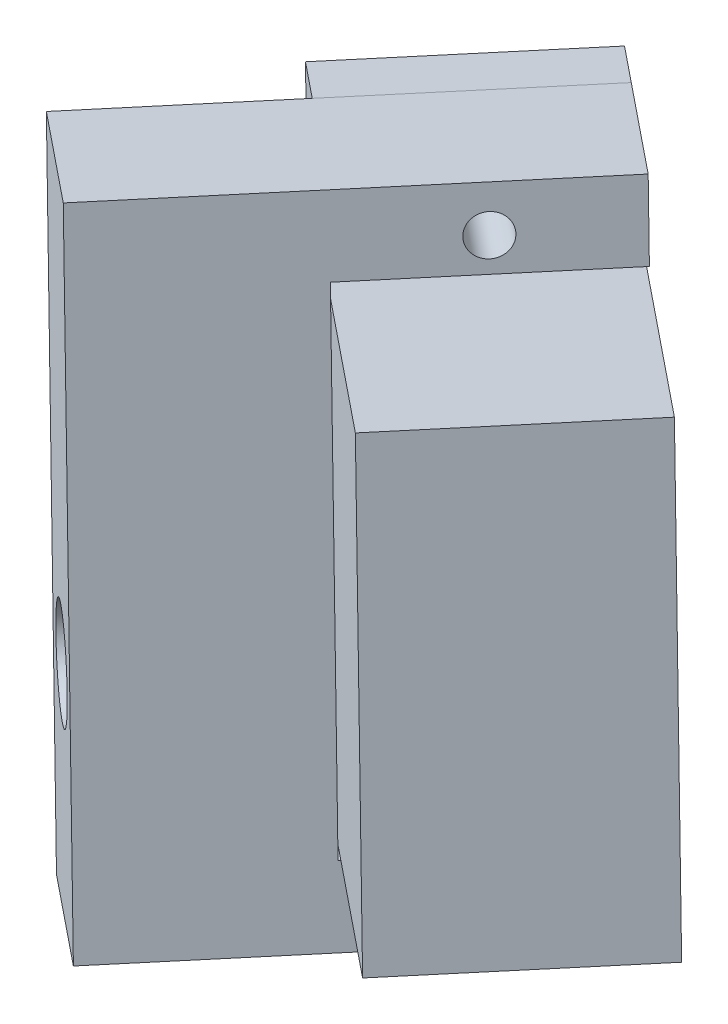
ISO-10303-21;
HEADER;
FILE_DESCRIPTION(('STEP AP214'),'2;1');
FILE_NAME('part.step','',(''),(''),'','','');
FILE_SCHEMA(('AUTOMOTIVE_DESIGN { 1 0 10303 214 1 1 1 1 }'));
ENDSEC;
DATA;
#1=APPLICATION_CONTEXT('core data for automotive mechanical design processes');
#2=APPLICATION_PROTOCOL_DEFINITION('international standard','automotive_design',2000,#1);
#3=PRODUCT_CONTEXT('',#1,'mechanical');
#4=PRODUCT('Part','Part','',(#3));
#5=PRODUCT_RELATED_PRODUCT_CATEGORY('part','',(#4));
#6=PRODUCT_DEFINITION_FORMATION('','',#4);
#7=PRODUCT_DEFINITION_CONTEXT('part definition',#1,'design');
#8=PRODUCT_DEFINITION('design','',#6,#7);
#9=PRODUCT_DEFINITION_SHAPE('','',#8);
#10=(LENGTH_UNIT() NAMED_UNIT(*) SI_UNIT(.MILLI.,.METRE.));
#11=(NAMED_UNIT(*) PLANE_ANGLE_UNIT() SI_UNIT($,.RADIAN.));
#12=(NAMED_UNIT(*) SI_UNIT($,.STERADIAN.) SOLID_ANGLE_UNIT());
#13=UNCERTAINTY_MEASURE_WITH_UNIT(LENGTH_MEASURE(1.E-05),#10,'distance_accuracy_value','');
#14=(GEOMETRIC_REPRESENTATION_CONTEXT(3) GLOBAL_UNCERTAINTY_ASSIGNED_CONTEXT((#13)) GLOBAL_UNIT_ASSIGNED_CONTEXT((#10,
#11,#12)) REPRESENTATION_CONTEXT('',''));
#15=CARTESIAN_POINT('',(0.,0.,0.));
#16=DIRECTION('',(0.,0.,1.));
#17=DIRECTION('',(1.,0.,0.));
#18=AXIS2_PLACEMENT_3D('',#15,#16,#17);
#19=CARTESIAN_POINT('',(-146.288038578442,36.1767455249788,-144.142058865633));
#20=DIRECTION('',(0.75749507175027,0.138140590001996,0.638058299583944));
#21=DIRECTION('',(-0.644234817231312,0.,0.764827758561977));
#22=AXIS2_PLACEMENT_3D('',#19,#20,#21);
#23=CYLINDRICAL_SURFACE('',#22,5.75);
#24=CARTESIAN_POINT('',(-146.288038578442,36.1767455249788,-144.142058865633));
#25=DIRECTION('',(-0.75749507175027,-0.138140590001996,-0.638058299583944));
#26=DIRECTION('',(0.644234817231312,0.,-0.764827758561977));
#27=AXIS2_PLACEMENT_3D('',#24,#25,#26);
#28=CIRCLE('',#27,5.75);
#29=CARTESIAN_POINT('',(-142.583688379362,36.1767455249787,-148.539818477364));
#30=VERTEX_POINT('',#29);
#31=EDGE_CURVE('P0_E141',#30,#30,#28,.T.);
#32=ORIENTED_EDGE('',*,*,#31,.F.);
#33=EDGE_LOOP('',(#32));
#34=FACE_BOUND('',#33,.T.);
#35=DIRECTION('',(0.75749507175027,0.138140590001996,0.638058299583944));
#36=VECTOR('',#35,1.);
#37=CARTESIAN_POINT('',(-145.903809061681,41.8163649980901,-140.725619216385));
#38=LINE('',#37,#36);
#39=CARTESIAN_POINT('',(-147.986920508995,41.4364783755846,-142.48027954024));
#40=VERTEX_POINT('',#39);
#41=CARTESIAN_POINT('',(-143.820697614368,42.1962516205956,-138.970958892529));
#42=VERTEX_POINT('',#41);
#43=EDGE_CURVE('P0_E20',#40,#42,#38,.T.);
#44=ORIENTED_EDGE('',*,*,#43,.F.);
#45=CARTESIAN_POINT('',(-145.909291042567,36.2458158199798,-143.823029715841));
#46=DIRECTION('',(-0.75749507175027,-0.138140590001996,-0.638058299583944));
#47=DIRECTION('',(0.644234817231312,0.,-0.764827758561977));
#48=AXIS2_PLACEMENT_3D('',#45,#46,#47);
#49=CIRCLE('',#48,5.75);
#50=CARTESIAN_POINT('',(-144.93910505581,41.4364783755846,-146.098609067334));
#51=VERTEX_POINT('',#50);
#52=EDGE_CURVE('P0_E130',#40,#51,#49,.T.);
#53=ORIENTED_EDGE('',*,*,#52,.T.);
#54=DIRECTION('',(0.75749507175027,0.138140590001996,0.638058299583944));
#55=VECTOR('',#54,1.);
#56=CARTESIAN_POINT('',(-142.855993608497,41.8163649980901,-144.343948743478));
#57=LINE('',#56,#55);
#58=CARTESIAN_POINT('',(-140.772882161184,42.1962516205956,-142.589288419622));
#59=VERTEX_POINT('',#58);
#60=EDGE_CURVE('P0_E120',#59,#51,#57,.F.);
#61=ORIENTED_EDGE('',*,*,#60,.F.);
#62=CARTESIAN_POINT('',(-141.743068147941,37.0055890649907,-140.313709068129));
#63=DIRECTION('',(-0.75749507175027,-0.138140590001996,-0.638058299583944));
#64=DIRECTION('',(0.644234817231312,0.,-0.764827758561977));
#65=AXIS2_PLACEMENT_3D('',#62,#63,#64);
#66=CIRCLE('',#65,5.75);
#67=EDGE_CURVE('P0_E129',#59,#42,#66,.T.);
#68=ORIENTED_EDGE('',*,*,#67,.T.);
#69=EDGE_LOOP('',(#44,#53,#61,#68));
#70=FACE_BOUND('',#69,.T.);
#71=ADVANCED_FACE('P0_F16',(#34,#70),#23,.T.);
#72=CARTESIAN_POINT('',(-141.161507768858,42.4124662567791,-139.823845251952));
#73=DIRECTION('',(0.75749507175027,0.138140590001996,0.638058299583944));
#74=DIRECTION('',(-0.644234817231312,0.,0.764827758561977));
#75=AXIS2_PLACEMENT_3D('',#72,#73,#74);
#76=PLANE('',#75);
#77=DIRECTION('',(-0.644234817231312,0.,0.764827758561977));
#78=VECTOR('',#77,1.);
#79=CARTESIAN_POINT('',(-136.107494090022,31.2703241708104,-143.411618303612));
#80=LINE('',#79,#78);
#81=CARTESIAN_POINT('',(-136.107494090022,31.2703241708104,-143.411618303612));
#82=VERTEX_POINT('',#81);
#83=CARTESIAN_POINT('',(-143.838311896797,31.2703241708104,-134.233685200868));
#84=VERTEX_POINT('',#83);
#85=EDGE_CURVE('P0_E39',#82,#84,#80,.T.);
#86=ORIENTED_EDGE('',*,*,#85,.F.);
#87=DIRECTION('',(0.105653757817654,-0.990412629863887,0.0889949777521639));
#88=VECTOR('',#87,1.);
#89=CARTESIAN_POINT('',(-138.997124366334,58.3581095975877,-145.845630945134));
#90=LINE('',#89,#88);
#91=CARTESIAN_POINT('',(-135.595073364606,26.4668229159705,-142.979992661514));
#92=VERTEX_POINT('',#91);
#93=EDGE_CURVE('P0_E177',#82,#92,#90,.T.);
#94=ORIENTED_EDGE('',*,*,#93,.T.);
#95=DIRECTION('',(-0.644234817231312,0.,0.764827758561977));
#96=VECTOR('',#95,1.);
#97=CARTESIAN_POINT('',(-135.595073364606,26.4668229159705,-142.979992661514));
#98=LINE('',#97,#96);
#99=CARTESIAN_POINT('',(-143.325891171382,26.4668229159706,-133.80205955877));
#100=VERTEX_POINT('',#99);
#101=EDGE_CURVE('P0_E168',#92,#100,#98,.T.);
#102=ORIENTED_EDGE('',*,*,#101,.T.);
#103=DIRECTION('',(-0.105653757817654,0.990412629863887,-0.0889949777521639));
#104=VECTOR('',#103,1.);
#105=CARTESIAN_POINT('',(-146.72794217311,58.3581095975877,-136.66769784239));
#106=LINE('',#105,#104);
#107=EDGE_CURVE('P0_E173',#100,#84,#106,.T.);
#108=ORIENTED_EDGE('',*,*,#107,.T.);
#109=EDGE_LOOP('',(#86,#94,#102,#108));
#110=FACE_BOUND('',#109,.T.);
#111=ADVANCED_FACE('P0_F248',(#110),#76,.F.);
#112=DIRECTION('',(0.644234817231312,0.,-0.764827758561977));
#113=VECTOR('',#112,1.);
#114=CARTESIAN_POINT('',(-138.484703640919,53.5546083427478,-145.414005303036));
#115=LINE('',#114,#113);
#116=CARTESIAN_POINT('',(-146.215521447694,53.5546083427479,-136.236072200292));
#117=VERTEX_POINT('',#116);
#118=CARTESIAN_POINT('',(-138.484703640919,53.5546083427478,-145.414005303036));
#119=VERTEX_POINT('',#118);
#120=EDGE_CURVE('P0_E146',#117,#119,#115,.T.);
#121=ORIENTED_EDGE('',*,*,#120,.F.);
#122=CARTESIAN_POINT('',(-146.72794217311,58.3581095975877,-136.66769784239));
#123=VERTEX_POINT('',#122);
#124=EDGE_CURVE('P0_E171',#117,#123,#106,.T.);
#125=ORIENTED_EDGE('',*,*,#124,.T.);
#126=DIRECTION('',(0.644234817231312,0.,-0.764827758561977));
#127=VECTOR('',#126,1.);
#128=CARTESIAN_POINT('',(-138.997124366334,58.3581095975877,-145.845630945134));
#129=LINE('',#128,#127);
#130=CARTESIAN_POINT('',(-138.997124366334,58.3581095975877,-145.845630945134));
#131=VERTEX_POINT('',#130);
#132=EDGE_CURVE('P0_E175',#123,#131,#129,.T.);
#133=ORIENTED_EDGE('',*,*,#132,.T.);
#134=EDGE_CURVE('P0_E178',#131,#119,#90,.T.);
#135=ORIENTED_EDGE('',*,*,#134,.T.);
#136=EDGE_LOOP('',(#121,#125,#133,#135));
#137=FACE_BOUND('',#136,.T.);
#138=ADVANCED_FACE('P0_F263',(#137),#76,.F.);
#139=CARTESIAN_POINT('',(-133.808595435316,31.4371427833504,-141.475194660422));
#140=DIRECTION('',(-0.105653757817654,0.990412629863887,-0.0889949777521639));
#141=DIRECTION('',(0.644234817231312,0.,-0.764827758561977));
#142=AXIS2_PLACEMENT_3D('',#139,#140,#141);
#143=PLANE('',#142);
#144=DIRECTION('',(-0.644234817231312,0.,0.764827758561977));
#145=VECTOR('',#144,1.);
#146=CARTESIAN_POINT('',(-119.794936607936,33.9927436983873,-129.671116118119));
#147=LINE('',#146,#145);
#148=CARTESIAN_POINT('',(-119.794936607936,33.9927436983873,-129.671116118119));
#149=VERTEX_POINT('',#148);
#150=CARTESIAN_POINT('',(-127.525754414712,33.9927436983874,-120.493183015375));
#151=VERTEX_POINT('',#150);
#152=EDGE_CURVE('P0_E203',#149,#151,#147,.T.);
#153=ORIENTED_EDGE('',*,*,#152,.T.);
#154=DIRECTION('',(0.75749507175027,0.138140590001996,0.638058299583944));
#155=VECTOR('',#154,1.);
#156=CARTESIAN_POINT('',(-141.539413242092,31.4371427833505,-132.297261557678));
#157=LINE('',#156,#155);
#158=CARTESIAN_POINT('',(-141.539413242092,31.4371427833505,-132.297261557678));
#159=VERTEX_POINT('',#158);
#160=EDGE_CURVE('P0_E133',#159,#151,#157,.T.);
#161=ORIENTED_EDGE('',*,*,#160,.F.);
#162=DIRECTION('',(-0.644234817231312,0.,0.764827758561977));
#163=VECTOR('',#162,1.);
#164=CARTESIAN_POINT('',(-133.808595435316,31.4371427833504,-141.475194660422));
#165=LINE('',#164,#163);
#166=CARTESIAN_POINT('',(-133.808595435316,31.4371427833504,-141.475194660422));
#167=VERTEX_POINT('',#166);
#168=EDGE_CURVE('P0_E204',#167,#159,#165,.T.);
#169=ORIENTED_EDGE('',*,*,#168,.F.);
#170=DIRECTION('',(0.75749507175027,0.138140590001996,0.638058299583944));
#171=VECTOR('',#170,1.);
#172=CARTESIAN_POINT('',(-133.808595435316,31.4371427833504,-141.475194660422));
#173=LINE('',#172,#171);
#174=EDGE_CURVE('P0_E211',#167,#149,#173,.T.);
#175=ORIENTED_EDGE('',*,*,#174,.T.);
#176=EDGE_LOOP('',(#153,#161,#169,#175));
#177=FACE_BOUND('',#176,.T.);
#178=ADVANCED_FACE('P0_F18',(#177),#143,.F.);
#179=CARTESIAN_POINT('',(-143.969449671898,54.2166332702198,-134.344146045978));
#180=DIRECTION('',(0.644234817231312,0.,-0.764827758561977));
#181=DIRECTION('',(0.105653757817654,-0.990412629863887,0.0889949777521642));
#182=AXIS2_PLACEMENT_3D('',#179,#180,#181);
#183=PLANE('',#182);
#184=DIRECTION('',(-0.105653757817654,0.990412629863887,-0.0889949777521642));
#185=VECTOR('',#184,1.);
#186=CARTESIAN_POINT('',(-129.955790844518,56.7722341852568,-122.540067503675));
#187=LINE('',#186,#185);
#188=CARTESIAN_POINT('',(-129.955790844518,56.7722341852568,-122.540067503675));
#189=VERTEX_POINT('',#188);
#190=EDGE_CURVE('P0_E214',#151,#189,#187,.T.);
#191=ORIENTED_EDGE('',*,*,#190,.T.);
#192=DIRECTION('',(0.75749507175027,0.138140590001996,0.638058299583944));
#193=VECTOR('',#192,1.);
#194=CARTESIAN_POINT('',(-143.969449671898,54.2166332702198,-134.344146045978));
#195=LINE('',#194,#193);
#196=CARTESIAN_POINT('',(-143.969449671898,54.2166332702198,-134.344146045978));
#197=VERTEX_POINT('',#196);
#198=EDGE_CURVE('P0_E137',#197,#189,#195,.T.);
#199=ORIENTED_EDGE('',*,*,#198,.F.);
#200=DIRECTION('',(-0.105653757817654,0.990412629863887,-0.0889949777521639));
#201=VECTOR('',#200,1.);
#202=CARTESIAN_POINT('',(-144.455456957859,58.7725313675937,-134.753522943638));
#203=LINE('',#202,#201);
#204=CARTESIAN_POINT('',(-144.455456957859,58.7725313675937,-134.753522943638));
#205=VERTEX_POINT('',#204);
#206=EDGE_CURVE('P0_E183',#197,#205,#203,.T.);
#207=ORIENTED_EDGE('',*,*,#206,.T.);
#208=DIRECTION('',(0.75749507175027,0.138140590001996,0.638058299583944));
#209=VECTOR('',#208,1.);
#210=CARTESIAN_POINT('',(-146.72794217311,58.3581095975877,-136.66769784239));
#211=LINE('',#210,#209);
#212=EDGE_CURVE('P0_E197',#123,#205,#211,.T.);
#213=ORIENTED_EDGE('',*,*,#212,.F.);
#214=ORIENTED_EDGE('',*,*,#124,.F.);
#215=DIRECTION('',(0.75749507175027,0.138140590001996,0.638058299583944));
#216=VECTOR('',#215,1.);
#217=CARTESIAN_POINT('',(-147.35176405532,53.3473974577449,-137.193159649668));
#218=LINE('',#217,#216);
#219=CARTESIAN_POINT('',(-147.35176405532,53.3473974577449,-137.193159649668));
#220=VERTEX_POINT('',#219);
#221=EDGE_CURVE('P0_E161',#220,#117,#218,.T.);
#222=ORIENTED_EDGE('',*,*,#221,.F.);
#223=DIRECTION('',(-0.105653757817654,0.990412629863887,-0.0889949777521639));
#224=VECTOR('',#223,1.);
#225=CARTESIAN_POINT('',(-147.35176405532,53.3473974577449,-137.193159649668));
#226=LINE('',#225,#224);
#227=CARTESIAN_POINT('',(-144.974554504423,31.0631132858074,-135.190772650244));
#228=VERTEX_POINT('',#227);
#229=EDGE_CURVE('P0_E145',#228,#220,#226,.T.);
#230=ORIENTED_EDGE('',*,*,#229,.F.);
#231=DIRECTION('',(0.75749507175027,0.138140590001996,0.638058299583944));
#232=VECTOR('',#231,1.);
#233=CARTESIAN_POINT('',(-144.974554504423,31.0631132858074,-135.190772650244));
#234=LINE('',#233,#232);
#235=EDGE_CURVE('P0_E164',#228,#84,#234,.T.);
#236=ORIENTED_EDGE('',*,*,#235,.T.);
#237=ORIENTED_EDGE('',*,*,#107,.F.);
#238=DIRECTION('',(0.75749507175027,0.138140590001996,0.638058299583944));
#239=VECTOR('',#238,1.);
#240=CARTESIAN_POINT('',(-143.325891171382,26.4668229159706,-133.80205955877));
#241=LINE('',#240,#239);
#242=CARTESIAN_POINT('',(-141.053405956131,26.8812446859766,-131.887884660018));
#243=VERTEX_POINT('',#242);
#244=EDGE_CURVE('P0_E200',#100,#243,#241,.T.);
#245=ORIENTED_EDGE('',*,*,#244,.T.);
#246=EDGE_CURVE('P0_E184',#243,#159,#203,.T.);
#247=ORIENTED_EDGE('',*,*,#246,.T.);
#248=ORIENTED_EDGE('',*,*,#160,.T.);
#249=EDGE_LOOP('',(#191,#199,#207,#213,#214,#222,#230,#236,#237,#245,#247,#248));
#250=FACE_BOUND('',#249,.T.);
#251=ADVANCED_FACE('P0_F265',(#250),#183,.F.);
#252=CARTESIAN_POINT('',(-136.238631865122,54.2166332702198,-143.522079148722));
#253=DIRECTION('',(0.105653757817654,-0.990412629863887,0.0889949777521639));
#254=DIRECTION('',(-0.644234817231312,0.,0.764827758561977));
#255=AXIS2_PLACEMENT_3D('',#252,#253,#254);
#256=PLANE('',#255);
#257=DIRECTION('',(0.644234817231312,0.,-0.764827758561977));
#258=VECTOR('',#257,1.);
#259=CARTESIAN_POINT('',(-122.224973037742,56.7722341852567,-131.718000606419));
#260=LINE('',#259,#258);
#261=CARTESIAN_POINT('',(-122.224973037742,56.7722341852567,-131.718000606419));
#262=VERTEX_POINT('',#261);
#263=EDGE_CURVE('P0_E216',#189,#262,#260,.T.);
#264=ORIENTED_EDGE('',*,*,#263,.T.);
#265=DIRECTION('',(0.75749507175027,0.138140590001996,0.638058299583944));
#266=VECTOR('',#265,1.);
#267=CARTESIAN_POINT('',(-136.238631865122,54.2166332702198,-143.522079148722));
#268=LINE('',#267,#266);
#269=CARTESIAN_POINT('',(-136.238631865122,54.2166332702198,-143.522079148722));
#270=VERTEX_POINT('',#269);
#271=EDGE_CURVE('P0_E221',#270,#262,#268,.T.);
#272=ORIENTED_EDGE('',*,*,#271,.F.);
#273=DIRECTION('',(0.644234817231312,0.,-0.764827758561977));
#274=VECTOR('',#273,1.);
#275=CARTESIAN_POINT('',(-136.238631865122,54.2166332702198,-143.522079148722));
#276=LINE('',#275,#274);
#277=EDGE_CURVE('P0_E207',#197,#270,#276,.T.);
#278=ORIENTED_EDGE('',*,*,#277,.F.);
#279=ORIENTED_EDGE('',*,*,#198,.T.);
#280=EDGE_LOOP('',(#264,#272,#278,#279));
#281=FACE_BOUND('',#280,.T.);
#282=ADVANCED_FACE('P0_F228',(#281),#256,.F.);
#283=CARTESIAN_POINT('',(-136.238631865122,54.2166332702198,-143.522079148722));
#284=DIRECTION('',(-0.644234817231312,0.,0.764827758561977));
#285=DIRECTION('',(-0.105653757817654,0.990412629863887,-0.0889949777521639));
#286=AXIS2_PLACEMENT_3D('',#283,#284,#285);
#287=PLANE('',#286);
#288=DIRECTION('',(0.105653757817654,-0.990412629863887,0.0889949777521639));
#289=VECTOR('',#288,1.);
#290=CARTESIAN_POINT('',(-122.224973037742,56.7722341852567,-131.718000606419));
#291=LINE('',#290,#289);
#292=EDGE_CURVE('P0_E208',#262,#149,#291,.T.);
#293=ORIENTED_EDGE('',*,*,#292,.T.);
#294=ORIENTED_EDGE('',*,*,#174,.F.);
#295=DIRECTION('',(0.105653757817654,-0.990412629863887,0.0889949777521639));
#296=VECTOR('',#295,1.);
#297=CARTESIAN_POINT('',(-136.724639151084,58.7725313675937,-143.931456046382));
#298=LINE('',#297,#296);
#299=CARTESIAN_POINT('',(-133.322588149355,26.8812446859765,-141.065817762762));
#300=VERTEX_POINT('',#299);
#301=EDGE_CURVE('P0_E189',#167,#300,#298,.T.);
#302=ORIENTED_EDGE('',*,*,#301,.T.);
#303=DIRECTION('',(0.75749507175027,0.138140590001996,0.638058299583944));
#304=VECTOR('',#303,1.);
#305=CARTESIAN_POINT('',(-135.595073364606,26.4668229159705,-142.979992661514));
#306=LINE('',#305,#304);
#307=EDGE_CURVE('P0_E180',#92,#300,#306,.T.);
#308=ORIENTED_EDGE('',*,*,#307,.F.);
#309=ORIENTED_EDGE('',*,*,#93,.F.);
#310=DIRECTION('',(0.75749507175027,0.138140590001996,0.638058299583944));
#311=VECTOR('',#310,1.);
#312=CARTESIAN_POINT('',(-137.243736697647,31.0631132858074,-144.368705752988));
#313=LINE('',#312,#311);
#314=CARTESIAN_POINT('',(-137.243736697647,31.0631132858074,-144.368705752988));
#315=VERTEX_POINT('',#314);
#316=EDGE_CURVE('P0_E152',#315,#82,#313,.T.);
#317=ORIENTED_EDGE('',*,*,#316,.F.);
#318=DIRECTION('',(0.105653757817654,-0.990412629863887,0.0889949777521639));
#319=VECTOR('',#318,1.);
#320=CARTESIAN_POINT('',(-139.620946248544,53.3473974577449,-146.371092752411));
#321=LINE('',#320,#319);
#322=CARTESIAN_POINT('',(-139.620946248544,53.3473974577449,-146.371092752411));
#323=VERTEX_POINT('',#322);
#324=EDGE_CURVE('P0_E150',#323,#315,#321,.T.);
#325=ORIENTED_EDGE('',*,*,#324,.F.);
#326=DIRECTION('',(0.75749507175027,0.138140590001996,0.638058299583944));
#327=VECTOR('',#326,1.);
#328=CARTESIAN_POINT('',(-139.620946248544,53.3473974577449,-146.371092752411));
#329=LINE('',#328,#327);
#330=EDGE_CURVE('P0_E158',#323,#119,#329,.T.);
#331=ORIENTED_EDGE('',*,*,#330,.T.);
#332=ORIENTED_EDGE('',*,*,#134,.F.);
#333=DIRECTION('',(0.75749507175027,0.138140590001996,0.638058299583944));
#334=VECTOR('',#333,1.);
#335=CARTESIAN_POINT('',(-138.997124366334,58.3581095975877,-145.845630945134));
#336=LINE('',#335,#334);
#337=CARTESIAN_POINT('',(-136.724639151084,58.7725313675937,-143.931456046382));
#338=VERTEX_POINT('',#337);
#339=EDGE_CURVE('P0_E194',#131,#338,#336,.T.);
#340=ORIENTED_EDGE('',*,*,#339,.T.);
#341=EDGE_CURVE('P0_E172',#338,#270,#298,.T.);
#342=ORIENTED_EDGE('',*,*,#341,.T.);
#343=ORIENTED_EDGE('',*,*,#271,.T.);
#344=EDGE_LOOP('',(#293,#294,#302,#308,#309,#317,#325,#331,#332,#340,#342,#343));
#345=FACE_BOUND('',#344,.T.);
#346=ADVANCED_FACE('P0_F236',(#345),#287,.F.);
#347=CARTESIAN_POINT('',(-124.875363726227,45.3824889418221,-126.105591810897));
#348=DIRECTION('',(0.75749507175027,0.138140590001996,0.638058299583944));
#349=DIRECTION('',(-0.644234817231312,0.,0.764827758561977));
#350=AXIS2_PLACEMENT_3D('',#347,#348,#349);
#351=PLANE('',#350);
#352=ORIENTED_EDGE('',*,*,#152,.F.);
#353=ORIENTED_EDGE('',*,*,#292,.F.);
#354=ORIENTED_EDGE('',*,*,#263,.F.);
#355=ORIENTED_EDGE('',*,*,#190,.F.);
#356=EDGE_LOOP('',(#352,#353,#354,#355));
#357=FACE_BOUND('',#356,.T.);
#358=ADVANCED_FACE('P0_F234',(#357),#351,.T.);
#359=CARTESIAN_POINT('',(-138.889022553607,42.8268880267851,-137.9096703532));
#360=DIRECTION('',(0.75749507175027,0.138140590001996,0.638058299583944));
#361=DIRECTION('',(-0.644234817231312,0.,0.764827758561977));
#362=AXIS2_PLACEMENT_3D('',#359,#360,#361);
#363=PLANE('',#362);
#364=ORIENTED_EDGE('',*,*,#301,.F.);
#365=ORIENTED_EDGE('',*,*,#168,.T.);
#366=ORIENTED_EDGE('',*,*,#246,.F.);
#367=DIRECTION('',(-0.644234817231312,0.,0.764827758561977));
#368=VECTOR('',#367,1.);
#369=CARTESIAN_POINT('',(-133.322588149355,26.8812446859765,-141.065817762762));
#370=LINE('',#369,#368);
#371=EDGE_CURVE('P0_E167',#300,#243,#370,.T.);
#372=ORIENTED_EDGE('',*,*,#371,.F.);
#373=EDGE_LOOP('',(#364,#365,#366,#372));
#374=FACE_BOUND('',#373,.T.);
#375=ADVANCED_FACE('P0_F242',(#374),#363,.T.);
#376=CARTESIAN_POINT('',(-135.595073364606,26.4668229159705,-142.979992661514));
#377=DIRECTION('',(-0.105653757817654,0.990412629863887,-0.0889949777521639));
#378=DIRECTION('',(0.644234817231312,0.,-0.764827758561977));
#379=AXIS2_PLACEMENT_3D('',#376,#377,#378);
#380=PLANE('',#379);
#381=ORIENTED_EDGE('',*,*,#371,.T.);
#382=ORIENTED_EDGE('',*,*,#244,.F.);
#383=ORIENTED_EDGE('',*,*,#101,.F.);
#384=ORIENTED_EDGE('',*,*,#307,.T.);
#385=EDGE_LOOP('',(#381,#382,#383,#384));
#386=FACE_BOUND('',#385,.T.);
#387=ADVANCED_FACE('P0_F246',(#386),#380,.F.);
#388=CARTESIAN_POINT('',(-138.997124366334,58.3581095975877,-145.845630945134));
#389=DIRECTION('',(0.105653757817654,-0.990412629863887,0.0889949777521639));
#390=DIRECTION('',(-0.644234817231312,0.,0.764827758561977));
#391=AXIS2_PLACEMENT_3D('',#388,#389,#390);
#392=PLANE('',#391);
#393=DIRECTION('',(0.644234817231312,0.,-0.764827758561977));
#394=VECTOR('',#393,1.);
#395=CARTESIAN_POINT('',(-136.724639151084,58.7725313675937,-143.931456046382));
#396=LINE('',#395,#394);
#397=EDGE_CURVE('P0_E187',#205,#338,#396,.T.);
#398=ORIENTED_EDGE('',*,*,#397,.T.);
#399=ORIENTED_EDGE('',*,*,#339,.F.);
#400=ORIENTED_EDGE('',*,*,#132,.F.);
#401=ORIENTED_EDGE('',*,*,#212,.T.);
#402=EDGE_LOOP('',(#398,#399,#400,#401));
#403=FACE_BOUND('',#402,.T.);
#404=ADVANCED_FACE('P0_F270',(#403),#392,.F.);
#405=ORIENTED_EDGE('',*,*,#206,.F.);
#406=ORIENTED_EDGE('',*,*,#277,.T.);
#407=ORIENTED_EDGE('',*,*,#341,.F.);
#408=ORIENTED_EDGE('',*,*,#397,.F.);
#409=EDGE_LOOP('',(#405,#406,#407,#408));
#410=FACE_BOUND('',#409,.T.);
#411=ADVANCED_FACE('P0_F273',(#410),#363,.T.);
#412=CARTESIAN_POINT('',(-137.243736697647,31.0631132858074,-144.368705752988));
#413=DIRECTION('',(-0.105653757817654,0.990412629863887,-0.0889949777521639));
#414=DIRECTION('',(0.644234817231312,0.,-0.764827758561977));
#415=AXIS2_PLACEMENT_3D('',#412,#413,#414);
#416=PLANE('',#415);
#417=ORIENTED_EDGE('',*,*,#85,.T.);
#418=ORIENTED_EDGE('',*,*,#235,.F.);
#419=DIRECTION('',(-0.644234817231312,0.,0.764827758561977));
#420=VECTOR('',#419,1.);
#421=CARTESIAN_POINT('',(-137.243736697647,31.0631132858074,-144.368705752988));
#422=LINE('',#421,#420);
#423=EDGE_CURVE('P0_E142',#315,#228,#422,.T.);
#424=ORIENTED_EDGE('',*,*,#423,.F.);
#425=ORIENTED_EDGE('',*,*,#316,.T.);
#426=EDGE_LOOP('',(#417,#418,#424,#425));
#427=FACE_BOUND('',#426,.T.);
#428=ADVANCED_FACE('P0_F253',(#427),#416,.F.);
#429=CARTESIAN_POINT('',(-139.620946248544,53.3473974577449,-146.371092752411));
#430=DIRECTION('',(0.105653757817654,-0.990412629863887,0.0889949777521639));
#431=DIRECTION('',(-0.644234817231312,0.,0.764827758561977));
#432=AXIS2_PLACEMENT_3D('',#429,#430,#431);
#433=PLANE('',#432);
#434=ORIENTED_EDGE('',*,*,#120,.T.);
#435=ORIENTED_EDGE('',*,*,#330,.F.);
#436=DIRECTION('',(0.644234817231312,0.,-0.764827758561977));
#437=VECTOR('',#436,1.);
#438=CARTESIAN_POINT('',(-139.620946248544,53.3473974577449,-146.371092752411));
#439=LINE('',#438,#437);
#440=EDGE_CURVE('P0_E148',#220,#323,#439,.T.);
#441=ORIENTED_EDGE('',*,*,#440,.F.);
#442=ORIENTED_EDGE('',*,*,#221,.T.);
#443=EDGE_LOOP('',(#434,#435,#441,#442));
#444=FACE_BOUND('',#443,.T.);
#445=ADVANCED_FACE('P0_F260',(#444),#433,.F.);
#446=CARTESIAN_POINT('',(-142.297750376483,42.2052553717761,-140.780932701328));
#447=DIRECTION('',(0.75749507175027,0.138140590001996,0.638058299583944));
#448=DIRECTION('',(-0.644234817231312,0.,0.764827758561977));
#449=AXIS2_PLACEMENT_3D('',#446,#447,#448);
#450=PLANE('',#449);
#451=CARTESIAN_POINT('',(-142.382273382738,42.9975854756673,-140.852128683529));
#452=DIRECTION('',(-0.75749507175027,-0.138140590001996,-0.638058299583944));
#453=DIRECTION('',(0.644234817231312,0.,-0.764827758561977));
#454=AXIS2_PLACEMENT_3D('',#451,#452,#453);
#455=CIRCLE('',#454,2.5);
#456=EDGE_CURVE('P0_E117',#42,#59,#455,.T.);
#457=ORIENTED_EDGE('',*,*,#456,.F.);
#458=ORIENTED_EDGE('',*,*,#67,.F.);
#459=EDGE_LOOP('',(#457,#458));
#460=FACE_BOUND('',#459,.T.);
#461=ORIENTED_EDGE('',*,*,#423,.T.);
#462=ORIENTED_EDGE('',*,*,#229,.T.);
#463=ORIENTED_EDGE('',*,*,#440,.T.);
#464=ORIENTED_EDGE('',*,*,#324,.T.);
#465=EDGE_LOOP('',(#461,#462,#463,#464));
#466=FACE_BOUND('',#465,.T.);
#467=ADVANCED_FACE('P0_F131',(#460,#466),#450,.F.);
#468=CARTESIAN_POINT('',(-146.288038578442,36.1767455249788,-144.142058865633));
#469=DIRECTION('',(-0.75749507175027,-0.138140590001996,-0.638058299583944));
#470=DIRECTION('',(0.644234817231312,0.,-0.764827758561977));
#471=AXIS2_PLACEMENT_3D('',#468,#469,#470);
#472=PLANE('',#471);
#473=CARTESIAN_POINT('',(-146.288038578442,36.1767455249788,-144.142058865633));
#474=DIRECTION('',(-0.75749507175027,-0.138140590001996,-0.638058299583944));
#475=DIRECTION('',(0.644234817231312,0.,-0.764827758561977));
#476=AXIS2_PLACEMENT_3D('',#473,#474,#475);
#477=CIRCLE('',#476,2.5);
#478=CARTESIAN_POINT('',(-144.677451535364,36.1767455249788,-146.054128262037));
#479=VERTEX_POINT('',#478);
#480=EDGE_CURVE('P0_E10',#479,#479,#477,.T.);
#481=ORIENTED_EDGE('',*,*,#480,.F.);
#482=EDGE_LOOP('',(#481));
#483=FACE_BOUND('',#482,.T.);
#484=ORIENTED_EDGE('',*,*,#31,.T.);
#485=EDGE_LOOP('',(#484));
#486=FACE_BOUND('',#485,.T.);
#487=ADVANCED_FACE('P0_F294',(#483,#486),#472,.T.);
#488=CARTESIAN_POINT('',(-146.548496277364,42.2378122306563,-144.361449331241));
#489=DIRECTION('',(0.75749507175027,0.138140590001996,0.638058299583944));
#490=DIRECTION('',(-0.644234817231312,0.,0.764827758561977));
#491=AXIS2_PLACEMENT_3D('',#488,#489,#490);
#492=CYLINDRICAL_SURFACE('',#491,2.5);
#493=CARTESIAN_POINT('',(-146.548496277364,42.2378122306563,-144.361449331241));
#494=DIRECTION('',(-0.75749507175027,-0.138140590001996,-0.638058299583944));
#495=DIRECTION('',(0.644234817231312,0.,-0.764827758561977));
#496=AXIS2_PLACEMENT_3D('',#493,#494,#495);
#497=CIRCLE('',#496,2.5);
#498=EDGE_CURVE('P0_E31',#40,#51,#497,.T.);
#499=ORIENTED_EDGE('',*,*,#498,.F.);
#500=ORIENTED_EDGE('',*,*,#43,.T.);
#501=ORIENTED_EDGE('',*,*,#456,.T.);
#502=ORIENTED_EDGE('',*,*,#60,.T.);
#503=EDGE_LOOP('',(#499,#500,#501,#502));
#504=FACE_BOUND('',#503,.T.);
#505=ADVANCED_FACE('P0_F119',(#504),#492,.T.);
#506=CARTESIAN_POINT('',(-146.548496277364,42.2378122306563,-144.361449331241));
#507=DIRECTION('',(-0.75749507175027,-0.138140590001996,-0.638058299583944));
#508=DIRECTION('',(0.644234817231312,0.,-0.764827758561977));
#509=AXIS2_PLACEMENT_3D('',#506,#507,#508);
#510=PLANE('',#509);
#511=ORIENTED_EDGE('',*,*,#52,.F.);
#512=ORIENTED_EDGE('',*,*,#498,.T.);
#513=EDGE_LOOP('',(#511,#512));
#514=FACE_BOUND('',#513,.T.);
#515=ADVANCED_FACE('P0_F322',(#514),#510,.T.);
#516=CARTESIAN_POINT('',(-148.939271329568,35.6932534599718,-146.375262914176));
#517=DIRECTION('',(0.75749507175027,0.138140590001996,0.638058299583944));
#518=DIRECTION('',(-0.644234817231312,0.,0.764827758561977));
#519=AXIS2_PLACEMENT_3D('',#516,#517,#518);
#520=CYLINDRICAL_SURFACE('',#519,2.5);
#521=CARTESIAN_POINT('',(-148.939271329568,35.6932534599718,-146.375262914176));
#522=DIRECTION('',(-0.75749507175027,-0.138140590001996,-0.638058299583944));
#523=DIRECTION('',(0.644234817231312,0.,-0.764827758561977));
#524=AXIS2_PLACEMENT_3D('',#521,#522,#523);
#525=CIRCLE('',#524,2.5);
#526=CARTESIAN_POINT('',(-147.32868428649,35.6932534599718,-148.287332310581));
#527=VERTEX_POINT('',#526);
#528=EDGE_CURVE('P0_E126',#527,#527,#525,.T.);
#529=ORIENTED_EDGE('',*,*,#528,.F.);
#530=EDGE_LOOP('',(#529));
#531=FACE_BOUND('',#530,.T.);
#532=ORIENTED_EDGE('',*,*,#480,.T.);
#533=EDGE_LOOP('',(#532));
#534=FACE_BOUND('',#533,.T.);
#535=ADVANCED_FACE('P0_F328',(#531,#534),#520,.T.);
#536=CARTESIAN_POINT('',(-148.939271329568,35.6932534599718,-146.375262914176));
#537=DIRECTION('',(-0.75749507175027,-0.138140590001996,-0.638058299583944));
#538=DIRECTION('',(0.644234817231312,0.,-0.764827758561977));
#539=AXIS2_PLACEMENT_3D('',#536,#537,#538);
#540=PLANE('',#539);
#541=ORIENTED_EDGE('',*,*,#528,.T.);
#542=EDGE_LOOP('',(#541));
#543=FACE_BOUND('',#542,.T.);
#544=ADVANCED_FACE('P0_F335',(#543),#540,.T.);
#545=CLOSED_SHELL('',(#71,#111,#138,#178,#251,#282,#346,#358,#375,#387,#404,#411,#428,#445,#467,
#487,#505,#515,#535,#544));
#546=MANIFOLD_SOLID_BREP('P0_B1',#545);
#547=CARTESIAN_POINT('',(-128.740772629615,45.3824889418222,-121.516625259525));
#548=DIRECTION('',(-0.644234817231312,0.,0.764827758561978));
#549=DIRECTION('',(-0.105653757817657,0.990412629863887,-0.08899497775216));
#550=AXIS2_PLACEMENT_3D('',#547,#548,#549);
#551=PLANE('',#550);
#552=CARTESIAN_POINT('',(-139.359142709389,38.1452489325073,-130.460761545189));
#553=DIRECTION('',(-0.644234817231312,0.,0.764827758561978));
#554=DIRECTION('',(-0.105653757817657,0.990412629863887,-0.08899497775216));
#555=AXIS2_PLACEMENT_3D('',#552,#553,#554);
#556=CIRCLE('',#555,2.5);
#557=CARTESIAN_POINT('',(-139.623277103933,40.621280507167,-130.68324898957));
#558=VERTEX_POINT('',#557);
#559=EDGE_CURVE('P1_E169',#558,#558,#556,.F.);
#560=ORIENTED_EDGE('',*,*,#559,.F.);
#561=EDGE_LOOP('',(#560));
#562=FACE_BOUND('',#561,.T.);
#563=DIRECTION('',(0.75749507175027,0.138140590001996,0.638058299583944));
#564=VECTOR('',#563,1.);
#565=CARTESIAN_POINT('',(-127.45179678424,33.2994548574828,-120.430886530949));
#566=LINE('',#565,#564);
#567=CARTESIAN_POINT('',(-141.46545561162,30.7438539424459,-132.234965073252));
#568=VERTEX_POINT('',#567);
#569=CARTESIAN_POINT('',(-135.784242573493,31.7799083674608,-127.449527826372));
#570=VERTEX_POINT('',#569);
#571=EDGE_CURVE('P1_E32',#568,#570,#566,.T.);
#572=ORIENTED_EDGE('',*,*,#571,.F.);
#573=DIRECTION('',(-0.105653757817657,0.990412629863887,-0.08899497775216));
#574=VECTOR('',#573,1.);
#575=CARTESIAN_POINT('',(-142.754431456995,42.8268880267853,-133.320703801828));
#576=LINE('',#575,#574);
#577=CARTESIAN_POINT('',(-144.043407302371,54.9099221111247,-134.406442530404));
#578=VERTEX_POINT('',#577);
#579=EDGE_CURVE('P1_E82',#568,#578,#576,.T.);
#580=ORIENTED_EDGE('',*,*,#579,.T.);
#581=DIRECTION('',(0.75749507175027,0.138140590001996,0.638058299583944));
#582=VECTOR('',#581,1.);
#583=CARTESIAN_POINT('',(-130.029748474991,57.4655230261616,-122.602363988101));
#584=LINE('',#583,#582);
#585=CARTESIAN_POINT('',(-138.362194264244,55.9459765361397,-129.621005283525));
#586=VERTEX_POINT('',#585);
#587=EDGE_CURVE('P1_E81',#578,#586,#584,.T.);
#588=ORIENTED_EDGE('',*,*,#587,.T.);
#589=DIRECTION('',(-0.105653757817657,0.990412629863887,-0.08899497775216));
#590=VECTOR('',#589,1.);
#591=CARTESIAN_POINT('',(-137.073218418868,43.8629424518002,-128.535266554948));
#592=LINE('',#591,#590);
#593=EDGE_CURVE('P1_E39',#570,#586,#592,.T.);
#594=ORIENTED_EDGE('',*,*,#593,.F.);
#595=EDGE_LOOP('',(#572,#580,#588,#594));
#596=FACE_BOUND('',#595,.T.);
#597=ADVANCED_FACE('P1_F17',(#562,#596),#551,.F.);
#598=CARTESIAN_POINT('',(-143.515566591181,43.8629424518002,-120.886988969329));
#599=DIRECTION('',(-0.75749507175027,-0.138140590001996,-0.638058299583944));
#600=DIRECTION('',(-0.644234817231312,0.,0.764827758561978));
#601=AXIS2_PLACEMENT_3D('',#598,#599,#600);
#602=PLANE('',#601);
#603=CARTESIAN_POINT('',(-134.671114061255,57.580157375415,-134.356813548188));
#604=DIRECTION('',(-0.75749507175027,-0.138140590001996,-0.638058299583944));
#605=DIRECTION('',(-0.644234817231312,0.,0.764827758561978));
#606=AXIS2_PLACEMENT_3D('',#603,#604,#605);
#607=CIRCLE('',#606,1.00000000000001);
#608=CARTESIAN_POINT('',(-135.315348878486,57.580157375415,-133.591985789626));
#609=VERTEX_POINT('',#608);
#610=EDGE_CURVE('P1_E98',#609,#609,#607,.F.);
#611=ORIENTED_EDGE('',*,*,#610,.F.);
#612=EDGE_LOOP('',(#611));
#613=FACE_BOUND('',#612,.T.);
#614=CARTESIAN_POINT('',(-131.744504969706,30.1457275281853,-131.891652664453));
#615=DIRECTION('',(-0.75749507175027,-0.138140590001996,-0.638058299583944));
#616=DIRECTION('',(-0.644234817231312,0.,0.764827758561978));
#617=AXIS2_PLACEMENT_3D('',#614,#615,#616);
#618=CIRCLE('',#617,0.98634220064662);
#619=CARTESIAN_POINT('',(-132.379940957067,30.1457275281853,-131.137270769957));
#620=VERTEX_POINT('',#619);
#621=EDGE_CURVE('P1_E167',#620,#620,#618,.F.);
#622=ORIENTED_EDGE('',*,*,#621,.F.);
#623=EDGE_LOOP('',(#622));
#624=FACE_BOUND('',#623,.T.);
#625=DIRECTION('',(0.644234817231312,0.,-0.764827758561978));
#626=VECTOR('',#625,1.);
#627=CARTESIAN_POINT('',(-141.814541090317,27.9172991109916,-119.454169827519));
#628=LINE('',#627,#626);
#629=CARTESIAN_POINT('',(-141.814541090317,27.9172991109916,-119.454169827519));
#630=VERTEX_POINT('',#629);
#631=CARTESIAN_POINT('',(-127.641375111228,27.9172991109917,-136.280380515882));
#632=VERTEX_POINT('',#631);
#633=EDGE_CURVE('P1_E135',#630,#632,#628,.T.);
#634=ORIENTED_EDGE('',*,*,#633,.T.);
#635=DIRECTION('',(0.105653757817657,-0.990412629863887,0.0889949777521598));
#636=VECTOR('',#635,1.);
#637=CARTESIAN_POINT('',(-129.342400612093,43.8629424518003,-137.713199657692));
#638=LINE('',#637,#636);
#639=CARTESIAN_POINT('',(-128.053424766717,31.7799083674608,-136.627460929116));
#640=VERTEX_POINT('',#639);
#641=EDGE_CURVE('P1_E89',#640,#632,#638,.T.);
#642=ORIENTED_EDGE('',*,*,#641,.F.);
#643=DIRECTION('',(-0.644234817231312,0.,0.764827758561977));
#644=VECTOR('',#643,1.);
#645=CARTESIAN_POINT('',(-122.607449079026,31.7799083674609,-143.092857189909));
#646=LINE('',#645,#644);
#647=EDGE_CURVE('P1_E87',#640,#570,#646,.T.);
#648=ORIENTED_EDGE('',*,*,#647,.T.);
#649=ORIENTED_EDGE('',*,*,#593,.T.);
#650=DIRECTION('',(-0.644234817231312,0.,0.764827758561977));
#651=VECTOR('',#650,1.);
#652=CARTESIAN_POINT('',(-125.185400769777,55.9459765361397,-145.264334647061));
#653=LINE('',#652,#651);
#654=CARTESIAN_POINT('',(-130.631376457468,55.9459765361397,-138.798938386268));
#655=VERTEX_POINT('',#654);
#656=EDGE_CURVE('P1_E114',#655,#586,#653,.T.);
#657=ORIENTED_EDGE('',*,*,#656,.F.);
#658=DIRECTION('',(0.105653757817657,-0.990412629863887,0.0889949777521598));
#659=VECTOR('',#658,1.);
#660=CARTESIAN_POINT('',(-129.342400612093,43.8629424518003,-137.713199657692));
#661=LINE('',#660,#659);
#662=CARTESIAN_POINT('',(-131.043426112957,59.8085857926089,-139.146018799502));
#663=VERTEX_POINT('',#662);
#664=EDGE_CURVE('P1_E111',#663,#655,#661,.T.);
#665=ORIENTED_EDGE('',*,*,#664,.F.);
#666=DIRECTION('',(0.644234817231312,0.,-0.764827758561978));
#667=VECTOR('',#666,1.);
#668=CARTESIAN_POINT('',(-145.216592092046,59.8085857926088,-122.319808111138));
#669=LINE('',#668,#667);
#670=CARTESIAN_POINT('',(-145.216592092046,59.8085857926088,-122.319808111138));
#671=VERTEX_POINT('',#670);
#672=EDGE_CURVE('P1_E11',#671,#663,#669,.T.);
#673=ORIENTED_EDGE('',*,*,#672,.F.);
#674=DIRECTION('',(-0.105653757817657,0.990412629863887,-0.08899497775216));
#675=VECTOR('',#674,1.);
#676=CARTESIAN_POINT('',(-143.515566591181,43.8629424518002,-120.886988969329));
#677=LINE('',#676,#675);
#678=EDGE_CURVE('P1_E126',#630,#671,#677,.T.);
#679=ORIENTED_EDGE('',*,*,#678,.F.);
#680=EDGE_LOOP('',(#634,#642,#648,#649,#657,#665,#673,#679));
#681=FACE_BOUND('',#680,.T.);
#682=ADVANCED_FACE('P1_F19',(#613,#624,#681),#602,.F.);
#683=CARTESIAN_POINT('',(-136.884146302793,61.3281322826308,-115.301166815715));
#684=DIRECTION('',(-0.105653757817657,0.990412629863887,-0.08899497775216));
#685=DIRECTION('',(0.644234817231312,0.,-0.764827758561978));
#686=AXIS2_PLACEMENT_3D('',#683,#684,#685);
#687=PLANE('',#686);
#688=ORIENTED_EDGE('',*,*,#672,.T.);
#689=DIRECTION('',(-0.75749507175027,-0.138140590001996,-0.638058299583944));
#690=VECTOR('',#689,1.);
#691=CARTESIAN_POINT('',(-122.710980323704,61.3281322826308,-132.127377504078));
#692=LINE('',#691,#690);
#693=CARTESIAN_POINT('',(-136.724639151084,58.7725313675939,-143.931456046381));
#694=VERTEX_POINT('',#693);
#695=EDGE_CURVE('P1_E113',#663,#694,#692,.T.);
#696=ORIENTED_EDGE('',*,*,#695,.T.);
#697=DIRECTION('',(0.644234817231312,0.,-0.764827758561978));
#698=VECTOR('',#697,1.);
#699=CARTESIAN_POINT('',(-150.897805130173,58.7725313675938,-127.105245358018));
#700=LINE('',#699,#698);
#701=CARTESIAN_POINT('',(-150.897805130173,58.7725313675938,-127.105245358018));
#702=VERTEX_POINT('',#701);
#703=EDGE_CURVE('P1_E25',#702,#694,#700,.T.);
#704=ORIENTED_EDGE('',*,*,#703,.F.);
#705=DIRECTION('',(0.75749507175027,0.138140590001996,0.638058299583944));
#706=VECTOR('',#705,1.);
#707=CARTESIAN_POINT('',(-136.884146302793,61.3281322826308,-115.301166815715));
#708=LINE('',#707,#706);
#709=EDGE_CURVE('P1_E128',#702,#671,#708,.T.);
#710=ORIENTED_EDGE('',*,*,#709,.T.);
#711=EDGE_LOOP('',(#688,#696,#704,#710));
#712=FACE_BOUND('',#711,.T.);
#713=ADVANCED_FACE('P1_F152',(#712),#687,.T.);
#714=CARTESIAN_POINT('',(-149.196779629308,42.8268880267853,-125.672426216208));
#715=DIRECTION('',(-0.75749507175027,-0.138140590001996,-0.638058299583944));
#716=DIRECTION('',(-0.644234817231312,0.,0.764827758561978));
#717=AXIS2_PLACEMENT_3D('',#714,#715,#716);
#718=PLANE('',#717);
#719=CARTESIAN_POINT('',(-140.352327099382,56.5441029504,-139.142250795067));
#720=DIRECTION('',(-0.75749507175027,-0.138140590001996,-0.638058299583944));
#721=DIRECTION('',(-0.644234817231312,0.,0.764827758561978));
#722=AXIS2_PLACEMENT_3D('',#719,#720,#721);
#723=CIRCLE('',#722,1.00000000000001);
#724=CARTESIAN_POINT('',(-140.996561916613,56.5441029504,-138.377423036505));
#725=VERTEX_POINT('',#724);
#726=EDGE_CURVE('P1_E102',#725,#725,#723,.T.);
#727=ORIENTED_EDGE('',*,*,#726,.F.);
#728=EDGE_LOOP('',(#727));
#729=FACE_BOUND('',#728,.T.);
#730=CARTESIAN_POINT('',(-137.425718007833,29.1096731031704,-136.677089911332));
#731=DIRECTION('',(-0.75749507175027,-0.138140590001996,-0.638058299583944));
#732=DIRECTION('',(-0.644234817231312,0.,0.764827758561978));
#733=AXIS2_PLACEMENT_3D('',#730,#731,#732);
#734=CIRCLE('',#733,0.98634220064662);
#735=CARTESIAN_POINT('',(-138.061153995194,29.1096731031704,-135.922708016837));
#736=VERTEX_POINT('',#735);
#737=EDGE_CURVE('P1_E164',#736,#736,#734,.T.);
#738=ORIENTED_EDGE('',*,*,#737,.F.);
#739=EDGE_LOOP('',(#738));
#740=FACE_BOUND('',#739,.T.);
#741=ORIENTED_EDGE('',*,*,#579,.F.);
#742=DIRECTION('',(-0.644234817231312,0.,0.764827758561977));
#743=VECTOR('',#742,1.);
#744=CARTESIAN_POINT('',(-128.288662117153,30.7438539424459,-147.878294436788));
#745=LINE('',#744,#743);
#746=CARTESIAN_POINT('',(-133.734637804844,30.7438539424459,-141.412898175995));
#747=VERTEX_POINT('',#746);
#748=EDGE_CURVE('P1_E93',#747,#568,#745,.T.);
#749=ORIENTED_EDGE('',*,*,#748,.F.);
#750=DIRECTION('',(0.105653757817657,-0.990412629863887,0.0889949777521598));
#751=VECTOR('',#750,1.);
#752=CARTESIAN_POINT('',(-135.02361365022,42.8268880267853,-142.498636904572));
#753=LINE('',#752,#751);
#754=CARTESIAN_POINT('',(-133.322588149355,26.8812446859767,-141.065817762762));
#755=VERTEX_POINT('',#754);
#756=EDGE_CURVE('P1_E92',#747,#755,#753,.T.);
#757=ORIENTED_EDGE('',*,*,#756,.T.);
#758=DIRECTION('',(0.644234817231312,0.,-0.764827758561978));
#759=VECTOR('',#758,1.);
#760=CARTESIAN_POINT('',(-147.495754128444,26.8812446859767,-124.239607074398));
#761=LINE('',#760,#759);
#762=CARTESIAN_POINT('',(-147.495754128444,26.8812446859767,-124.239607074398));
#763=VERTEX_POINT('',#762);
#764=EDGE_CURVE('P1_E139',#763,#755,#761,.T.);
#765=ORIENTED_EDGE('',*,*,#764,.F.);
#766=DIRECTION('',(-0.105653757817657,0.990412629863887,-0.08899497775216));
#767=VECTOR('',#766,1.);
#768=CARTESIAN_POINT('',(-149.196779629308,42.8268880267853,-125.672426216208));
#769=LINE('',#768,#767);
#770=EDGE_CURVE('P1_E131',#763,#702,#769,.T.);
#771=ORIENTED_EDGE('',*,*,#770,.T.);
#772=ORIENTED_EDGE('',*,*,#703,.T.);
#773=DIRECTION('',(0.105653757817657,-0.990412629863887,0.0889949777521598));
#774=VECTOR('',#773,1.);
#775=CARTESIAN_POINT('',(-135.02361365022,42.8268880267853,-142.498636904572));
#776=LINE('',#775,#774);
#777=CARTESIAN_POINT('',(-136.312589495595,54.9099221111247,-143.584375633148));
#778=VERTEX_POINT('',#777);
#779=EDGE_CURVE('P1_E117',#694,#778,#776,.T.);
#780=ORIENTED_EDGE('',*,*,#779,.T.);
#781=DIRECTION('',(-0.644234817231312,0.,0.764827758561977));
#782=VECTOR('',#781,1.);
#783=CARTESIAN_POINT('',(-130.866613807904,54.9099221111247,-150.049771893941));
#784=LINE('',#783,#782);
#785=EDGE_CURVE('P1_E121',#778,#578,#784,.T.);
#786=ORIENTED_EDGE('',*,*,#785,.T.);
#787=EDGE_LOOP('',(#741,#749,#757,#765,#771,#772,#780,#786));
#788=FACE_BOUND('',#787,.T.);
#789=ADVANCED_FACE('P1_F142',(#729,#740,#788),#718,.T.);
#790=CARTESIAN_POINT('',(-133.482095301064,29.4368456010136,-112.435528532095));
#791=DIRECTION('',(-0.105653757817657,0.990412629863887,-0.08899497775216));
#792=DIRECTION('',(0.644234817231312,0.,-0.764827758561978));
#793=AXIS2_PLACEMENT_3D('',#790,#791,#792);
#794=PLANE('',#793);
#795=ORIENTED_EDGE('',*,*,#764,.T.);
#796=DIRECTION('',(-0.75749507175027,-0.138140590001996,-0.638058299583944));
#797=VECTOR('',#796,1.);
#798=CARTESIAN_POINT('',(-119.308929321975,29.4368456010136,-129.261739220459));
#799=LINE('',#798,#797);
#800=EDGE_CURVE('P1_E110',#632,#755,#799,.T.);
#801=ORIENTED_EDGE('',*,*,#800,.F.);
#802=ORIENTED_EDGE('',*,*,#633,.F.);
#803=DIRECTION('',(0.75749507175027,0.138140590001996,0.638058299583944));
#804=VECTOR('',#803,1.);
#805=CARTESIAN_POINT('',(-133.482095301064,29.4368456010136,-112.435528532095));
#806=LINE('',#805,#804);
#807=EDGE_CURVE('P1_E134',#763,#630,#806,.T.);
#808=ORIENTED_EDGE('',*,*,#807,.F.);
#809=EDGE_LOOP('',(#795,#801,#802,#808));
#810=FACE_BOUND('',#809,.T.);
#811=ADVANCED_FACE('P1_F184',(#810),#794,.F.);
#812=CARTESIAN_POINT('',(-135.183120801928,45.3824889418222,-113.868347673905));
#813=DIRECTION('',(-0.644234817231312,0.,0.764827758561978));
#814=DIRECTION('',(-0.105653757817657,0.990412629863887,-0.08899497775216));
#815=AXIS2_PLACEMENT_3D('',#812,#813,#814);
#816=PLANE('',#815);
#817=CARTESIAN_POINT('',(-145.801490881702,38.1452489325073,-122.81248395957));
#818=DIRECTION('',(-0.644234817231312,0.,0.764827758561978));
#819=DIRECTION('',(-0.105653757817657,0.990412629863887,-0.08899497775216));
#820=AXIS2_PLACEMENT_3D('',#817,#818,#819);
#821=CIRCLE('',#820,2.5);
#822=CARTESIAN_POINT('',(-146.065625276246,40.621280507167,-123.03497140395));
#823=VERTEX_POINT('',#822);
#824=EDGE_CURVE('P1_E175',#823,#823,#821,.T.);
#825=ORIENTED_EDGE('',*,*,#824,.F.);
#826=EDGE_LOOP('',(#825));
#827=FACE_BOUND('',#826,.T.);
#828=ORIENTED_EDGE('',*,*,#678,.T.);
#829=ORIENTED_EDGE('',*,*,#709,.F.);
#830=ORIENTED_EDGE('',*,*,#770,.F.);
#831=ORIENTED_EDGE('',*,*,#807,.T.);
#832=EDGE_LOOP('',(#828,#829,#830,#831));
#833=FACE_BOUND('',#832,.T.);
#834=ADVANCED_FACE('P1_F181',(#827,#833),#816,.T.);
#835=CARTESIAN_POINT('',(-116.852954980524,57.4655230261617,-138.245693351638));
#836=DIRECTION('',(0.105653757817657,-0.990412629863887,0.08899497775216));
#837=DIRECTION('',(-0.644234817231312,0.,0.764827758561978));
#838=AXIS2_PLACEMENT_3D('',#835,#836,#837);
#839=PLANE('',#838);
#840=DIRECTION('',(-0.75749507175027,-0.138140590001996,-0.638058299583944));
#841=VECTOR('',#840,1.);
#842=CARTESIAN_POINT('',(-122.298930668215,57.4655230261616,-131.780297090845));
#843=LINE('',#842,#841);
#844=EDGE_CURVE('P1_E83',#655,#778,#843,.T.);
#845=ORIENTED_EDGE('',*,*,#844,.F.);
#846=ORIENTED_EDGE('',*,*,#656,.T.);
#847=ORIENTED_EDGE('',*,*,#587,.F.);
#848=ORIENTED_EDGE('',*,*,#785,.F.);
#849=EDGE_LOOP('',(#845,#846,#847,#848));
#850=FACE_BOUND('',#849,.T.);
#851=ADVANCED_FACE('P1_F156',(#850),#839,.T.);
#852=CARTESIAN_POINT('',(-136.238631865123,54.2166332702199,-143.522079148721));
#853=DIRECTION('',(-0.644234817231312,0.,0.764827758561978));
#854=DIRECTION('',(-0.105653757817657,0.990412629863887,-0.0889949777521597));
#855=AXIS2_PLACEMENT_3D('',#852,#853,#854);
#856=PLANE('',#855);
#857=ORIENTED_EDGE('',*,*,#695,.F.);
#858=ORIENTED_EDGE('',*,*,#664,.T.);
#859=ORIENTED_EDGE('',*,*,#844,.T.);
#860=ORIENTED_EDGE('',*,*,#779,.F.);
#861=EDGE_LOOP('',(#857,#858,#859,#860));
#862=FACE_BOUND('',#861,.T.);
#863=ADVANCED_FACE('P1_F149',(#862),#856,.F.);
#864=CARTESIAN_POINT('',(-114.275003289773,33.2994548574828,-136.074215894485));
#865=DIRECTION('',(0.105653757817657,-0.990412629863887,0.08899497775216));
#866=DIRECTION('',(-0.644234817231312,0.,0.764827758561978));
#867=AXIS2_PLACEMENT_3D('',#864,#865,#866);
#868=PLANE('',#867);
#869=ORIENTED_EDGE('',*,*,#647,.F.);
#870=DIRECTION('',(-0.75749507175027,-0.138140590001996,-0.638058299583944));
#871=VECTOR('',#870,1.);
#872=CARTESIAN_POINT('',(-119.720978977464,33.2994548574828,-129.608819633692));
#873=LINE('',#872,#871);
#874=EDGE_CURVE('P1_E105',#640,#747,#873,.T.);
#875=ORIENTED_EDGE('',*,*,#874,.T.);
#876=ORIENTED_EDGE('',*,*,#748,.T.);
#877=ORIENTED_EDGE('',*,*,#571,.T.);
#878=EDGE_LOOP('',(#869,#875,#876,#877));
#879=FACE_BOUND('',#878,.T.);
#880=ADVANCED_FACE('P1_F96',(#879),#868,.F.);
#881=CARTESIAN_POINT('',(-136.238631865123,54.2166332702199,-143.522079148721));
#882=DIRECTION('',(-0.644234817231312,0.,0.764827758561978));
#883=DIRECTION('',(-0.105653757817657,0.990412629863887,-0.0889949777521597));
#884=AXIS2_PLACEMENT_3D('',#881,#882,#883);
#885=PLANE('',#884);
#886=ORIENTED_EDGE('',*,*,#641,.T.);
#887=ORIENTED_EDGE('',*,*,#800,.T.);
#888=ORIENTED_EDGE('',*,*,#756,.F.);
#889=ORIENTED_EDGE('',*,*,#874,.F.);
#890=EDGE_LOOP('',(#886,#887,#888,#889));
#891=FACE_BOUND('',#890,.T.);
#892=ADVANCED_FACE('P1_F160',(#891),#885,.F.);
#893=CARTESIAN_POINT('',(-129.601985361906,30.5364481199754,-130.08695126274));
#894=DIRECTION('',(-0.75749507175027,-0.138140590001996,-0.638058299583944));
#895=DIRECTION('',(-0.644234817231312,0.,0.764827758561978));
#896=AXIS2_PLACEMENT_3D('',#893,#894,#895);
#897=CYLINDRICAL_SURFACE('',#896,0.98634220064662);
#898=ORIENTED_EDGE('',*,*,#621,.T.);
#899=EDGE_LOOP('',(#898));
#900=FACE_BOUND('',#899,.T.);
#901=ORIENTED_EDGE('',*,*,#737,.T.);
#902=EDGE_LOOP('',(#901));
#903=FACE_BOUND('',#902,.T.);
#904=ADVANCED_FACE('P1_F213',(#900,#903),#897,.F.);
#905=CARTESIAN_POINT('',(-132.528594453455,57.9708779672051,-132.552112146475));
#906=DIRECTION('',(-0.75749507175027,-0.138140590001996,-0.638058299583944));
#907=DIRECTION('',(-0.644234817231312,0.,0.764827758561978));
#908=AXIS2_PLACEMENT_3D('',#905,#906,#907);
#909=CYLINDRICAL_SURFACE('',#908,1.00000000000001);
#910=ORIENTED_EDGE('',*,*,#610,.T.);
#911=EDGE_LOOP('',(#910));
#912=FACE_BOUND('',#911,.T.);
#913=ORIENTED_EDGE('',*,*,#726,.T.);
#914=EDGE_LOOP('',(#913));
#915=FACE_BOUND('',#914,.T.);
#916=ADVANCED_FACE('P1_F216',(#912,#915),#909,.F.);
#917=CARTESIAN_POINT('',(-134.803714629982,38.1452489325073,-135.868910490378));
#918=DIRECTION('',(-0.644234817231312,0.,0.764827758561977));
#919=DIRECTION('',(-0.105653757817657,0.990412629863887,-0.08899497775216));
#920=AXIS2_PLACEMENT_3D('',#917,#918,#919);
#921=CYLINDRICAL_SURFACE('',#920,2.5);
#922=ORIENTED_EDGE('',*,*,#559,.T.);
#923=EDGE_LOOP('',(#922));
#924=FACE_BOUND('',#923,.T.);
#925=ORIENTED_EDGE('',*,*,#824,.T.);
#926=EDGE_LOOP('',(#925));
#927=FACE_BOUND('',#926,.T.);
#928=ADVANCED_FACE('P1_F179',(#924,#927),#921,.F.);
#929=CLOSED_SHELL('',(#597,#682,#713,#789,#811,#834,#851,#863,#880,#892,#904,#916,#928));
#930=MANIFOLD_SOLID_BREP('P1_B1',#929);
#931=ADVANCED_BREP_SHAPE_REPRESENTATION('',(#18,#546,#930),#14);
#932=SHAPE_DEFINITION_REPRESENTATION(#9,#931);
ENDSEC;
END-ISO-10303-21;
